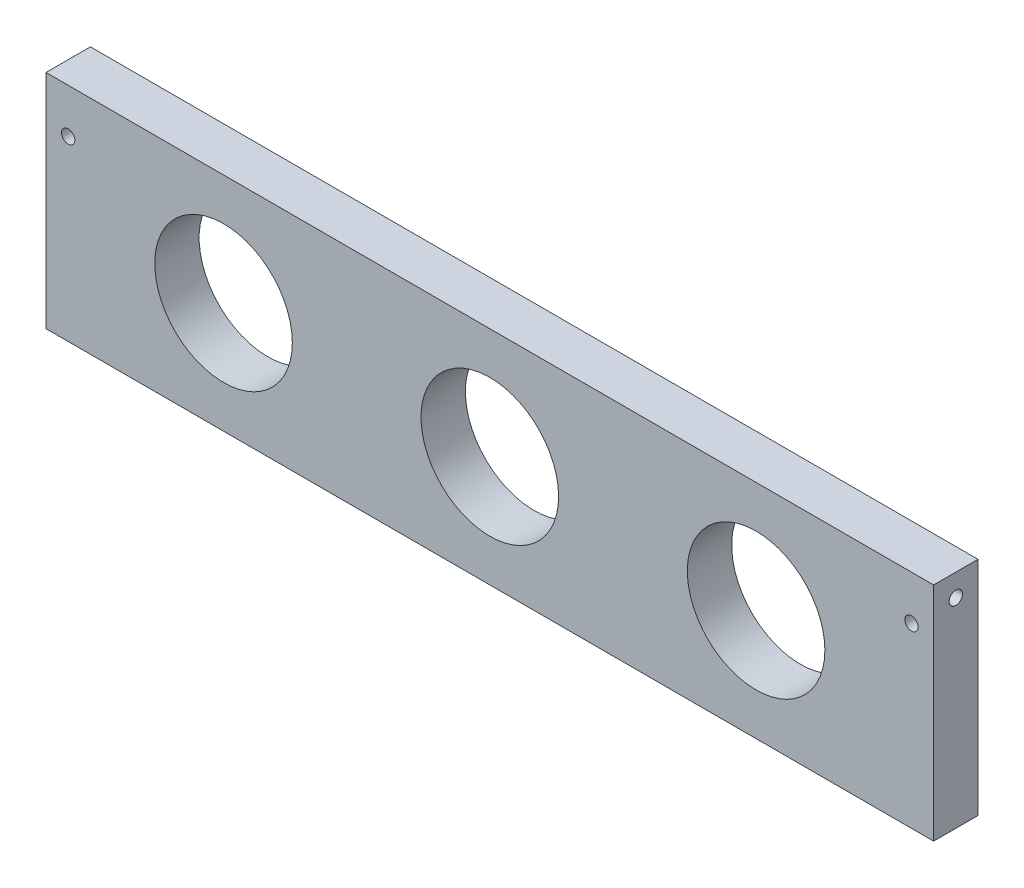
ISO-10303-21;
HEADER;
FILE_DESCRIPTION(('STEP AP214'),'2;1');
FILE_NAME('part.step','',(''),(''),'','','');
FILE_SCHEMA(('AUTOMOTIVE_DESIGN { 1 0 10303 214 1 1 1 1 }'));
ENDSEC;
DATA;
#1=APPLICATION_CONTEXT('core data for automotive mechanical design processes');
#2=APPLICATION_PROTOCOL_DEFINITION('international standard','automotive_design',2000,#1);
#3=PRODUCT_CONTEXT('',#1,'mechanical');
#4=PRODUCT('Part','Part','',(#3));
#5=PRODUCT_RELATED_PRODUCT_CATEGORY('part','',(#4));
#6=PRODUCT_DEFINITION_FORMATION('','',#4);
#7=PRODUCT_DEFINITION_CONTEXT('part definition',#1,'design');
#8=PRODUCT_DEFINITION('design','',#6,#7);
#9=PRODUCT_DEFINITION_SHAPE('','',#8);
#10=(LENGTH_UNIT() NAMED_UNIT(*) SI_UNIT(.MILLI.,.METRE.));
#11=(NAMED_UNIT(*) PLANE_ANGLE_UNIT() SI_UNIT($,.RADIAN.));
#12=(NAMED_UNIT(*) SI_UNIT($,.STERADIAN.) SOLID_ANGLE_UNIT());
#13=UNCERTAINTY_MEASURE_WITH_UNIT(LENGTH_MEASURE(1.E-05),#10,'distance_accuracy_value','');
#14=(GEOMETRIC_REPRESENTATION_CONTEXT(3) GLOBAL_UNCERTAINTY_ASSIGNED_CONTEXT((#13)) GLOBAL_UNIT_ASSIGNED_CONTEXT((#10,
#11,#12)) REPRESENTATION_CONTEXT('',''));
#15=CARTESIAN_POINT('',(0.,0.,0.));
#16=DIRECTION('',(0.,0.,1.));
#17=DIRECTION('',(1.,0.,0.));
#18=AXIS2_PLACEMENT_3D('',#15,#16,#17);
#19=CARTESIAN_POINT('',(0.,0.,10.));
#20=DIRECTION('',(0.,0.,1.));
#21=DIRECTION('',(1.,0.,0.));
#22=AXIS2_PLACEMENT_3D('',#19,#20,#21);
#23=PLANE('',#22);
#24=CARTESIAN_POINT('',(95.,15.,10.));
#25=DIRECTION('',(0.,0.,1.));
#26=DIRECTION('',(1.,0.,0.));
#27=AXIS2_PLACEMENT_3D('',#24,#25,#26);
#28=CIRCLE('',#27,1.5);
#29=CARTESIAN_POINT('',(96.5,15.,10.));
#30=VERTEX_POINT('',#29);
#31=EDGE_CURVE('E129',#30,#30,#28,.T.);
#32=ORIENTED_EDGE('',*,*,#31,.F.);
#33=EDGE_LOOP('',(#32));
#34=FACE_BOUND('',#33,.T.);
#35=CARTESIAN_POINT('',(60.,0.,10.));
#36=DIRECTION('',(0.,0.,1.));
#37=DIRECTION('',(1.,0.,0.));
#38=AXIS2_PLACEMENT_3D('',#35,#36,#37);
#39=CIRCLE('',#38,15.5);
#40=CARTESIAN_POINT('',(75.5,0.,10.));
#41=VERTEX_POINT('',#40);
#42=EDGE_CURVE('E117',#41,#41,#39,.T.);
#43=ORIENTED_EDGE('',*,*,#42,.F.);
#44=EDGE_LOOP('',(#43));
#45=FACE_BOUND('',#44,.T.);
#46=DIRECTION('',(0.,1.,0.));
#47=VECTOR('',#46,1.);
#48=CARTESIAN_POINT('',(100.,25.,10.));
#49=LINE('',#48,#47);
#50=CARTESIAN_POINT('',(100.,-25.,10.));
#51=VERTEX_POINT('',#50);
#52=CARTESIAN_POINT('',(100.,25.,10.));
#53=VERTEX_POINT('',#52);
#54=EDGE_CURVE('E87',#51,#53,#49,.T.);
#55=ORIENTED_EDGE('',*,*,#54,.T.);
#56=DIRECTION('',(-1.,0.,0.));
#57=VECTOR('',#56,1.);
#58=CARTESIAN_POINT('',(-100.,25.,10.));
#59=LINE('',#58,#57);
#60=CARTESIAN_POINT('',(-100.,25.,10.));
#61=VERTEX_POINT('',#60);
#62=EDGE_CURVE('E82',#53,#61,#59,.T.);
#63=ORIENTED_EDGE('',*,*,#62,.T.);
#64=DIRECTION('',(0.,-1.,0.));
#65=VECTOR('',#64,1.);
#66=CARTESIAN_POINT('',(-100.,25.,10.));
#67=LINE('',#66,#65);
#68=CARTESIAN_POINT('',(-100.,-25.,10.));
#69=VERTEX_POINT('',#68);
#70=EDGE_CURVE('E85',#61,#69,#67,.T.);
#71=ORIENTED_EDGE('',*,*,#70,.T.);
#72=DIRECTION('',(1.,0.,0.));
#73=VECTOR('',#72,1.);
#74=CARTESIAN_POINT('',(-100.,-25.,10.));
#75=LINE('',#74,#73);
#76=EDGE_CURVE('E52',#69,#51,#75,.T.);
#77=ORIENTED_EDGE('',*,*,#76,.T.);
#78=EDGE_LOOP('',(#55,#63,#71,#77));
#79=FACE_BOUND('',#78,.T.);
#80=CARTESIAN_POINT('',(0.,0.,10.));
#81=DIRECTION('',(0.,0.,1.));
#82=DIRECTION('',(1.,0.,0.));
#83=AXIS2_PLACEMENT_3D('',#80,#81,#82);
#84=CIRCLE('',#83,15.5);
#85=CARTESIAN_POINT('',(15.5,0.,10.));
#86=VERTEX_POINT('',#85);
#87=EDGE_CURVE('E102',#86,#86,#84,.T.);
#88=ORIENTED_EDGE('',*,*,#87,.F.);
#89=EDGE_LOOP('',(#88));
#90=FACE_BOUND('',#89,.T.);
#91=CARTESIAN_POINT('',(-60.,0.,10.));
#92=DIRECTION('',(0.,0.,1.));
#93=DIRECTION('',(1.,0.,0.));
#94=AXIS2_PLACEMENT_3D('',#91,#92,#93);
#95=CIRCLE('',#94,15.5);
#96=CARTESIAN_POINT('',(-44.5,0.,10.));
#97=VERTEX_POINT('',#96);
#98=EDGE_CURVE('E123',#97,#97,#95,.T.);
#99=ORIENTED_EDGE('',*,*,#98,.F.);
#100=EDGE_LOOP('',(#99));
#101=FACE_BOUND('',#100,.T.);
#102=CARTESIAN_POINT('',(-95.,15.,10.));
#103=DIRECTION('',(0.,0.,1.));
#104=DIRECTION('',(1.,0.,0.));
#105=AXIS2_PLACEMENT_3D('',#102,#103,#104);
#106=CIRCLE('',#105,1.5);
#107=CARTESIAN_POINT('',(-93.5,15.,10.));
#108=VERTEX_POINT('',#107);
#109=EDGE_CURVE('E135',#108,#108,#106,.T.);
#110=ORIENTED_EDGE('',*,*,#109,.F.);
#111=EDGE_LOOP('',(#110));
#112=FACE_BOUND('',#111,.T.);
#113=ADVANCED_FACE('F35',(#34,#45,#79,#90,#101,#112),#23,.T.);
#114=CARTESIAN_POINT('',(0.,0.,0.));
#115=DIRECTION('',(0.,0.,1.));
#116=DIRECTION('',(1.,0.,0.));
#117=AXIS2_PLACEMENT_3D('',#114,#115,#116);
#118=PLANE('',#117);
#119=CARTESIAN_POINT('',(95.,15.,0.));
#120=DIRECTION('',(0.,0.,1.));
#121=DIRECTION('',(1.,0.,0.));
#122=AXIS2_PLACEMENT_3D('',#119,#120,#121);
#123=CIRCLE('',#122,1.5);
#124=CARTESIAN_POINT('',(96.5,15.,0.));
#125=VERTEX_POINT('',#124);
#126=EDGE_CURVE('E132',#125,#125,#123,.T.);
#127=ORIENTED_EDGE('',*,*,#126,.T.);
#128=EDGE_LOOP('',(#127));
#129=FACE_BOUND('',#128,.T.);
#130=CARTESIAN_POINT('',(60.,0.,0.));
#131=DIRECTION('',(0.,0.,1.));
#132=DIRECTION('',(1.,0.,0.));
#133=AXIS2_PLACEMENT_3D('',#130,#131,#132);
#134=CIRCLE('',#133,15.5);
#135=CARTESIAN_POINT('',(75.5,0.,0.));
#136=VERTEX_POINT('',#135);
#137=EDGE_CURVE('E120',#136,#136,#134,.T.);
#138=ORIENTED_EDGE('',*,*,#137,.T.);
#139=EDGE_LOOP('',(#138));
#140=FACE_BOUND('',#139,.T.);
#141=DIRECTION('',(0.,1.,0.));
#142=VECTOR('',#141,1.);
#143=CARTESIAN_POINT('',(100.,25.,0.));
#144=LINE('',#143,#142);
#145=CARTESIAN_POINT('',(100.,-25.,0.));
#146=VERTEX_POINT('',#145);
#147=CARTESIAN_POINT('',(100.,25.,0.));
#148=VERTEX_POINT('',#147);
#149=EDGE_CURVE('E99',#146,#148,#144,.T.);
#150=ORIENTED_EDGE('',*,*,#149,.F.);
#151=DIRECTION('',(1.,0.,0.));
#152=VECTOR('',#151,1.);
#153=CARTESIAN_POINT('',(-100.,-25.,0.));
#154=LINE('',#153,#152);
#155=CARTESIAN_POINT('',(-100.,-25.,0.));
#156=VERTEX_POINT('',#155);
#157=EDGE_CURVE('E75',#156,#146,#154,.T.);
#158=ORIENTED_EDGE('',*,*,#157,.F.);
#159=DIRECTION('',(0.,-1.,0.));
#160=VECTOR('',#159,1.);
#161=CARTESIAN_POINT('',(-100.,25.,0.));
#162=LINE('',#161,#160);
#163=CARTESIAN_POINT('',(-100.,25.,0.));
#164=VERTEX_POINT('',#163);
#165=EDGE_CURVE('E69',#164,#156,#162,.T.);
#166=ORIENTED_EDGE('',*,*,#165,.F.);
#167=DIRECTION('',(-1.,0.,0.));
#168=VECTOR('',#167,1.);
#169=CARTESIAN_POINT('',(-100.,25.,0.));
#170=LINE('',#169,#168);
#171=EDGE_CURVE('E91',#148,#164,#170,.T.);
#172=ORIENTED_EDGE('',*,*,#171,.F.);
#173=EDGE_LOOP('',(#150,#158,#166,#172));
#174=FACE_BOUND('',#173,.T.);
#175=CARTESIAN_POINT('',(0.,0.,0.));
#176=DIRECTION('',(0.,0.,1.));
#177=DIRECTION('',(1.,0.,0.));
#178=AXIS2_PLACEMENT_3D('',#175,#176,#177);
#179=CIRCLE('',#178,15.5);
#180=CARTESIAN_POINT('',(15.5,0.,0.));
#181=VERTEX_POINT('',#180);
#182=EDGE_CURVE('E114',#181,#181,#179,.T.);
#183=ORIENTED_EDGE('',*,*,#182,.T.);
#184=EDGE_LOOP('',(#183));
#185=FACE_BOUND('',#184,.T.);
#186=CARTESIAN_POINT('',(-60.,0.,0.));
#187=DIRECTION('',(0.,0.,1.));
#188=DIRECTION('',(1.,0.,0.));
#189=AXIS2_PLACEMENT_3D('',#186,#187,#188);
#190=CIRCLE('',#189,15.5);
#191=CARTESIAN_POINT('',(-44.5,0.,0.));
#192=VERTEX_POINT('',#191);
#193=EDGE_CURVE('E126',#192,#192,#190,.T.);
#194=ORIENTED_EDGE('',*,*,#193,.T.);
#195=EDGE_LOOP('',(#194));
#196=FACE_BOUND('',#195,.T.);
#197=CARTESIAN_POINT('',(-95.,15.,0.));
#198=DIRECTION('',(0.,0.,1.));
#199=DIRECTION('',(1.,0.,0.));
#200=AXIS2_PLACEMENT_3D('',#197,#198,#199);
#201=CIRCLE('',#200,1.5);
#202=CARTESIAN_POINT('',(-93.5,15.,0.));
#203=VERTEX_POINT('',#202);
#204=EDGE_CURVE('E138',#203,#203,#201,.T.);
#205=ORIENTED_EDGE('',*,*,#204,.T.);
#206=EDGE_LOOP('',(#205));
#207=FACE_BOUND('',#206,.T.);
#208=ADVANCED_FACE('F110',(#129,#140,#174,#185,#196,#207),#118,.F.);
#209=CARTESIAN_POINT('',(100.,25.,10.));
#210=DIRECTION('',(-1.,0.,0.));
#211=DIRECTION('',(0.,0.,1.));
#212=AXIS2_PLACEMENT_3D('',#209,#210,#211);
#213=PLANE('',#212);
#214=CARTESIAN_POINT('',(100.,20.,5.));
#215=DIRECTION('',(1.,0.,0.));
#216=DIRECTION('',(0.,0.,-1.));
#217=AXIS2_PLACEMENT_3D('',#214,#215,#216);
#218=CIRCLE('',#217,1.5);
#219=CARTESIAN_POINT('',(100.,20.,3.5));
#220=VERTEX_POINT('',#219);
#221=EDGE_CURVE('E156',#220,#220,#218,.T.);
#222=ORIENTED_EDGE('',*,*,#221,.F.);
#223=EDGE_LOOP('',(#222));
#224=FACE_BOUND('',#223,.T.);
#225=ORIENTED_EDGE('',*,*,#149,.T.);
#226=DIRECTION('',(0.,0.,-1.));
#227=VECTOR('',#226,1.);
#228=CARTESIAN_POINT('',(100.,25.,10.));
#229=LINE('',#228,#227);
#230=EDGE_CURVE('E11',#53,#148,#229,.T.);
#231=ORIENTED_EDGE('',*,*,#230,.F.);
#232=ORIENTED_EDGE('',*,*,#54,.F.);
#233=DIRECTION('',(0.,0.,-1.));
#234=VECTOR('',#233,1.);
#235=CARTESIAN_POINT('',(100.,-25.,10.));
#236=LINE('',#235,#234);
#237=EDGE_CURVE('E95',#51,#146,#236,.T.);
#238=ORIENTED_EDGE('',*,*,#237,.T.);
#239=EDGE_LOOP('',(#225,#231,#232,#238));
#240=FACE_BOUND('',#239,.T.);
#241=ADVANCED_FACE('F37',(#224,#240),#213,.F.);
#242=CARTESIAN_POINT('',(-100.,25.,10.));
#243=DIRECTION('',(0.,-1.,0.));
#244=DIRECTION('',(1.,0.,0.));
#245=AXIS2_PLACEMENT_3D('',#242,#243,#244);
#246=PLANE('',#245);
#247=ORIENTED_EDGE('',*,*,#171,.T.);
#248=DIRECTION('',(0.,0.,-1.));
#249=VECTOR('',#248,1.);
#250=CARTESIAN_POINT('',(-100.,25.,10.));
#251=LINE('',#250,#249);
#252=EDGE_CURVE('E44',#61,#164,#251,.T.);
#253=ORIENTED_EDGE('',*,*,#252,.F.);
#254=ORIENTED_EDGE('',*,*,#62,.F.);
#255=ORIENTED_EDGE('',*,*,#230,.T.);
#256=EDGE_LOOP('',(#247,#253,#254,#255));
#257=FACE_BOUND('',#256,.T.);
#258=ADVANCED_FACE('F90',(#257),#246,.F.);
#259=CARTESIAN_POINT('',(-100.,25.,10.));
#260=DIRECTION('',(1.,0.,0.));
#261=DIRECTION('',(0.,0.,-1.));
#262=AXIS2_PLACEMENT_3D('',#259,#260,#261);
#263=PLANE('',#262);
#264=CARTESIAN_POINT('',(-100.,20.,5.));
#265=DIRECTION('',(1.,0.,0.));
#266=DIRECTION('',(0.,0.,-1.));
#267=AXIS2_PLACEMENT_3D('',#264,#265,#266);
#268=CIRCLE('',#267,1.5);
#269=CARTESIAN_POINT('',(-100.,20.,3.5));
#270=VERTEX_POINT('',#269);
#271=EDGE_CURVE('E153',#270,#270,#268,.T.);
#272=ORIENTED_EDGE('',*,*,#271,.T.);
#273=EDGE_LOOP('',(#272));
#274=FACE_BOUND('',#273,.T.);
#275=ORIENTED_EDGE('',*,*,#165,.T.);
#276=DIRECTION('',(0.,0.,-1.));
#277=VECTOR('',#276,1.);
#278=CARTESIAN_POINT('',(-100.,-25.,10.));
#279=LINE('',#278,#277);
#280=EDGE_CURVE('E92',#69,#156,#279,.T.);
#281=ORIENTED_EDGE('',*,*,#280,.F.);
#282=ORIENTED_EDGE('',*,*,#70,.F.);
#283=ORIENTED_EDGE('',*,*,#252,.T.);
#284=EDGE_LOOP('',(#275,#281,#282,#283));
#285=FACE_BOUND('',#284,.T.);
#286=ADVANCED_FACE('F93',(#274,#285),#263,.F.);
#287=CARTESIAN_POINT('',(-100.,-25.,10.));
#288=DIRECTION('',(0.,1.,0.));
#289=DIRECTION('',(0.,0.,1.));
#290=AXIS2_PLACEMENT_3D('',#287,#288,#289);
#291=PLANE('',#290);
#292=CARTESIAN_POINT('',(95.,-25.,5.));
#293=DIRECTION('',(0.,-1.,0.));
#294=DIRECTION('',(0.,0.,-1.));
#295=AXIS2_PLACEMENT_3D('',#292,#293,#294);
#296=CIRCLE('',#295,2.5);
#297=CARTESIAN_POINT('',(95.,-25.,2.5));
#298=VERTEX_POINT('',#297);
#299=EDGE_CURVE('E150',#298,#298,#296,.T.);
#300=ORIENTED_EDGE('',*,*,#299,.F.);
#301=EDGE_LOOP('',(#300));
#302=FACE_BOUND('',#301,.T.);
#303=CARTESIAN_POINT('',(-95.,-25.,5.));
#304=DIRECTION('',(0.,-1.,0.));
#305=DIRECTION('',(0.,0.,-1.));
#306=AXIS2_PLACEMENT_3D('',#303,#304,#305);
#307=CIRCLE('',#306,2.49999999999999);
#308=CARTESIAN_POINT('',(-95.,-25.,2.50000000000001));
#309=VERTEX_POINT('',#308);
#310=EDGE_CURVE('E144',#309,#309,#307,.T.);
#311=ORIENTED_EDGE('',*,*,#310,.F.);
#312=EDGE_LOOP('',(#311));
#313=FACE_BOUND('',#312,.T.);
#314=ORIENTED_EDGE('',*,*,#157,.T.);
#315=ORIENTED_EDGE('',*,*,#237,.F.);
#316=ORIENTED_EDGE('',*,*,#76,.F.);
#317=ORIENTED_EDGE('',*,*,#280,.T.);
#318=EDGE_LOOP('',(#314,#315,#316,#317));
#319=FACE_BOUND('',#318,.T.);
#320=ADVANCED_FACE('F107',(#302,#313,#319),#291,.F.);
#321=CARTESIAN_POINT('',(0.,0.,10.));
#322=DIRECTION('',(0.,0.,-1.));
#323=DIRECTION('',(-1.,0.,0.));
#324=AXIS2_PLACEMENT_3D('',#321,#322,#323);
#325=CYLINDRICAL_SURFACE('',#324,15.5);
#326=ORIENTED_EDGE('',*,*,#87,.T.);
#327=EDGE_LOOP('',(#326));
#328=FACE_BOUND('',#327,.T.);
#329=ORIENTED_EDGE('',*,*,#182,.F.);
#330=EDGE_LOOP('',(#329));
#331=FACE_BOUND('',#330,.T.);
#332=ADVANCED_FACE('F185',(#328,#331),#325,.F.);
#333=CARTESIAN_POINT('',(60.,0.,10.));
#334=DIRECTION('',(0.,0.,-1.));
#335=DIRECTION('',(-1.,0.,0.));
#336=AXIS2_PLACEMENT_3D('',#333,#334,#335);
#337=CYLINDRICAL_SURFACE('',#336,15.5);
#338=ORIENTED_EDGE('',*,*,#42,.T.);
#339=EDGE_LOOP('',(#338));
#340=FACE_BOUND('',#339,.T.);
#341=ORIENTED_EDGE('',*,*,#137,.F.);
#342=EDGE_LOOP('',(#341));
#343=FACE_BOUND('',#342,.T.);
#344=ADVANCED_FACE('F209',(#340,#343),#337,.F.);
#345=CARTESIAN_POINT('',(-60.,0.,10.));
#346=DIRECTION('',(0.,0.,-1.));
#347=DIRECTION('',(-1.,0.,0.));
#348=AXIS2_PLACEMENT_3D('',#345,#346,#347);
#349=CYLINDRICAL_SURFACE('',#348,15.5);
#350=ORIENTED_EDGE('',*,*,#98,.T.);
#351=EDGE_LOOP('',(#350));
#352=FACE_BOUND('',#351,.T.);
#353=ORIENTED_EDGE('',*,*,#193,.F.);
#354=EDGE_LOOP('',(#353));
#355=FACE_BOUND('',#354,.T.);
#356=ADVANCED_FACE('F216',(#352,#355),#349,.F.);
#357=CARTESIAN_POINT('',(95.,15.,10.));
#358=DIRECTION('',(0.,0.,-1.));
#359=DIRECTION('',(-1.,0.,0.));
#360=AXIS2_PLACEMENT_3D('',#357,#358,#359);
#361=CYLINDRICAL_SURFACE('',#360,1.5);
#362=ORIENTED_EDGE('',*,*,#31,.T.);
#363=EDGE_LOOP('',(#362));
#364=FACE_BOUND('',#363,.T.);
#365=ORIENTED_EDGE('',*,*,#126,.F.);
#366=EDGE_LOOP('',(#365));
#367=FACE_BOUND('',#366,.T.);
#368=ADVANCED_FACE('F223',(#364,#367),#361,.F.);
#369=CARTESIAN_POINT('',(-95.,15.,10.));
#370=DIRECTION('',(0.,0.,-1.));
#371=DIRECTION('',(-1.,0.,0.));
#372=AXIS2_PLACEMENT_3D('',#369,#370,#371);
#373=CYLINDRICAL_SURFACE('',#372,1.5);
#374=ORIENTED_EDGE('',*,*,#109,.T.);
#375=EDGE_LOOP('',(#374));
#376=FACE_BOUND('',#375,.T.);
#377=ORIENTED_EDGE('',*,*,#204,.F.);
#378=EDGE_LOOP('',(#377));
#379=FACE_BOUND('',#378,.T.);
#380=ADVANCED_FACE('F231',(#376,#379),#373,.F.);
#381=CARTESIAN_POINT('',(-95.,-15.,5.));
#382=DIRECTION('',(0.,-1.,0.));
#383=DIRECTION('',(0.,0.,-1.));
#384=AXIS2_PLACEMENT_3D('',#381,#382,#383);
#385=CYLINDRICAL_SURFACE('',#384,2.49999999999999);
#386=CARTESIAN_POINT('',(-95.,-15.,5.));
#387=DIRECTION('',(0.,-1.,0.));
#388=DIRECTION('',(0.,0.,-1.));
#389=AXIS2_PLACEMENT_3D('',#386,#387,#388);
#390=CIRCLE('',#389,2.49999999999999);
#391=CARTESIAN_POINT('',(-95.,-15.,2.50000000000001));
#392=VERTEX_POINT('',#391);
#393=EDGE_CURVE('E141',#392,#392,#390,.T.);
#394=ORIENTED_EDGE('',*,*,#393,.F.);
#395=EDGE_LOOP('',(#394));
#396=FACE_BOUND('',#395,.T.);
#397=ORIENTED_EDGE('',*,*,#310,.T.);
#398=EDGE_LOOP('',(#397));
#399=FACE_BOUND('',#398,.T.);
#400=ADVANCED_FACE('F238',(#396,#399),#385,.F.);
#401=CARTESIAN_POINT('',(-95.,-15.,5.));
#402=DIRECTION('',(0.,-1.,0.));
#403=DIRECTION('',(0.,0.,-1.));
#404=AXIS2_PLACEMENT_3D('',#401,#402,#403);
#405=PLANE('',#404);
#406=ORIENTED_EDGE('',*,*,#393,.T.);
#407=EDGE_LOOP('',(#406));
#408=FACE_BOUND('',#407,.T.);
#409=ADVANCED_FACE('F245',(#408),#405,.T.);
#410=CARTESIAN_POINT('',(95.,-15.,5.));
#411=DIRECTION('',(0.,-1.,0.));
#412=DIRECTION('',(0.,0.,-1.));
#413=AXIS2_PLACEMENT_3D('',#410,#411,#412);
#414=CYLINDRICAL_SURFACE('',#413,2.5);
#415=CARTESIAN_POINT('',(95.,-15.,5.));
#416=DIRECTION('',(0.,-1.,0.));
#417=DIRECTION('',(0.,0.,-1.));
#418=AXIS2_PLACEMENT_3D('',#415,#416,#417);
#419=CIRCLE('',#418,2.5);
#420=CARTESIAN_POINT('',(95.,-15.,2.5));
#421=VERTEX_POINT('',#420);
#422=EDGE_CURVE('E147',#421,#421,#419,.T.);
#423=ORIENTED_EDGE('',*,*,#422,.F.);
#424=EDGE_LOOP('',(#423));
#425=FACE_BOUND('',#424,.T.);
#426=ORIENTED_EDGE('',*,*,#299,.T.);
#427=EDGE_LOOP('',(#426));
#428=FACE_BOUND('',#427,.T.);
#429=ADVANCED_FACE('F253',(#425,#428),#414,.F.);
#430=CARTESIAN_POINT('',(95.,-15.,5.));
#431=DIRECTION('',(0.,-1.,0.));
#432=DIRECTION('',(0.,0.,-1.));
#433=AXIS2_PLACEMENT_3D('',#430,#431,#432);
#434=PLANE('',#433);
#435=ORIENTED_EDGE('',*,*,#422,.T.);
#436=EDGE_LOOP('',(#435));
#437=FACE_BOUND('',#436,.T.);
#438=ADVANCED_FACE('F166',(#437),#434,.T.);
#439=CARTESIAN_POINT('',(-100.,20.,5.));
#440=DIRECTION('',(1.,0.,0.));
#441=DIRECTION('',(0.,0.,-1.));
#442=AXIS2_PLACEMENT_3D('',#439,#440,#441);
#443=CYLINDRICAL_SURFACE('',#442,1.5);
#444=ORIENTED_EDGE('',*,*,#271,.F.);
#445=EDGE_LOOP('',(#444));
#446=FACE_BOUND('',#445,.T.);
#447=ORIENTED_EDGE('',*,*,#221,.T.);
#448=EDGE_LOOP('',(#447));
#449=FACE_BOUND('',#448,.T.);
#450=ADVANCED_FACE('F163',(#446,#449),#443,.F.);
#451=CLOSED_SHELL('',(#113,#208,#241,#258,#286,#320,#332,#344,#356,#368,#380,#400,#409,#429,
#438,#450));
#452=MANIFOLD_SOLID_BREP('B2',#451);
#453=ADVANCED_BREP_SHAPE_REPRESENTATION('',(#18,#452),#14);
#454=SHAPE_DEFINITION_REPRESENTATION(#9,#453);
ENDSEC;
END-ISO-10303-21;
